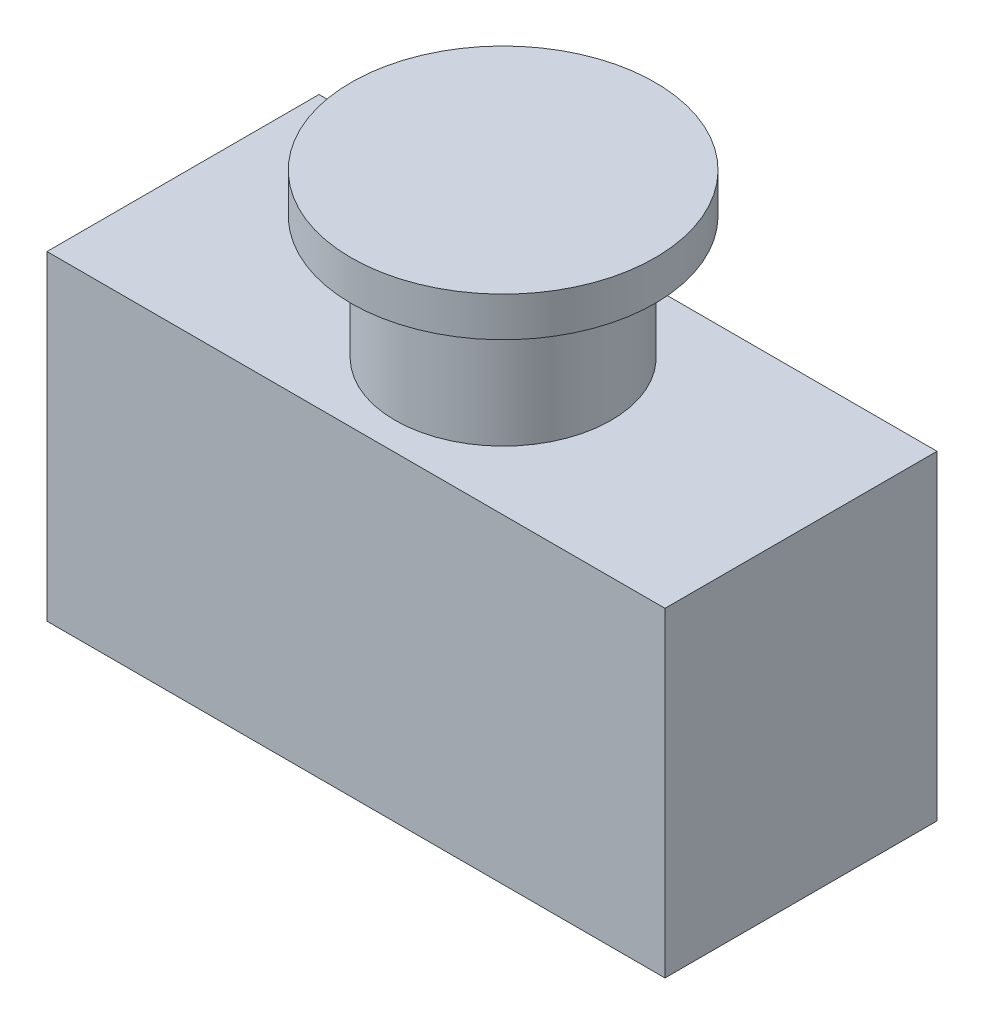
ISO-10303-21;
HEADER;
FILE_DESCRIPTION(('STEP AP214'),'2;1');
FILE_NAME('part.step','',(''),(''),'','','');
FILE_SCHEMA(('AUTOMOTIVE_DESIGN { 1 0 10303 214 1 1 1 1 }'));
ENDSEC;
DATA;
#1=APPLICATION_CONTEXT('core data for automotive mechanical design processes');
#2=APPLICATION_PROTOCOL_DEFINITION('international standard','automotive_design',2000,#1);
#3=PRODUCT_CONTEXT('',#1,'mechanical');
#4=PRODUCT('Part','Part','',(#3));
#5=PRODUCT_RELATED_PRODUCT_CATEGORY('part','',(#4));
#6=PRODUCT_DEFINITION_FORMATION('','',#4);
#7=PRODUCT_DEFINITION_CONTEXT('part definition',#1,'design');
#8=PRODUCT_DEFINITION('design','',#6,#7);
#9=PRODUCT_DEFINITION_SHAPE('','',#8);
#10=(LENGTH_UNIT() NAMED_UNIT(*) SI_UNIT(.MILLI.,.METRE.));
#11=(NAMED_UNIT(*) PLANE_ANGLE_UNIT() SI_UNIT($,.RADIAN.));
#12=(NAMED_UNIT(*) SI_UNIT($,.STERADIAN.) SOLID_ANGLE_UNIT());
#13=UNCERTAINTY_MEASURE_WITH_UNIT(LENGTH_MEASURE(1.E-05),#10,'distance_accuracy_value','');
#14=(GEOMETRIC_REPRESENTATION_CONTEXT(3) GLOBAL_UNCERTAINTY_ASSIGNED_CONTEXT((#13)) GLOBAL_UNIT_ASSIGNED_CONTEXT((#10,
#11,#12)) REPRESENTATION_CONTEXT('',''));
#15=CARTESIAN_POINT('',(0.,0.,0.));
#16=DIRECTION('',(0.,0.,1.));
#17=DIRECTION('',(1.,0.,0.));
#18=AXIS2_PLACEMENT_3D('',#15,#16,#17);
#19=CARTESIAN_POINT('',(126.415186096977,242.062,35.6459844357977));
#20=DIRECTION('',(0.,-1.,0.));
#21=DIRECTION('',(0.,0.,-1.));
#22=AXIS2_PLACEMENT_3D('',#19,#20,#21);
#23=CYLINDRICAL_SURFACE('',#22,54.2382607102503);
#24=CARTESIAN_POINT('',(126.415186096977,160.528,35.6459844357977));
#25=DIRECTION('',(0.,1.,0.));
#26=DIRECTION('',(0.,0.,1.));
#27=AXIS2_PLACEMENT_3D('',#24,#25,#26);
#28=CIRCLE('',#27,54.2382607102503);
#29=CARTESIAN_POINT('',(126.415186096977,160.528,89.884245146048));
#30=VERTEX_POINT('',#29);
#31=EDGE_CURVE('E103',#30,#30,#28,.T.);
#32=ORIENTED_EDGE('',*,*,#31,.T.);
#33=EDGE_LOOP('',(#32));
#34=FACE_BOUND('',#33,.T.);
#35=CARTESIAN_POINT('',(126.415186096977,222.25,35.6459844357977));
#36=DIRECTION('',(0.,1.,0.));
#37=DIRECTION('',(0.,0.,1.));
#38=AXIS2_PLACEMENT_3D('',#35,#36,#37);
#39=CIRCLE('',#38,54.2382607102503);
#40=CARTESIAN_POINT('',(126.415186096977,222.25,89.884245146048));
#41=VERTEX_POINT('',#40);
#42=EDGE_CURVE('E11',#41,#41,#39,.T.);
#43=ORIENTED_EDGE('',*,*,#42,.F.);
#44=EDGE_LOOP('',(#43));
#45=FACE_BOUND('',#44,.T.);
#46=ADVANCED_FACE('F32',(#34,#45),#23,.T.);
#47=CARTESIAN_POINT('',(-34.1128139030231,160.528,103.844984435798));
#48=DIRECTION('',(0.,1.,0.));
#49=DIRECTION('',(0.,0.,1.));
#50=AXIS2_PLACEMENT_3D('',#47,#48,#49);
#51=PLANE('',#50);
#52=DIRECTION('',(0.,0.,1.));
#53=VECTOR('',#52,1.);
#54=CARTESIAN_POINT('',(-34.1128139030231,160.528,-32.5530155642023));
#55=LINE('',#54,#53);
#56=CARTESIAN_POINT('',(-34.1128139030231,160.528,-32.5530155642023));
#57=VERTEX_POINT('',#56);
#58=CARTESIAN_POINT('',(-34.1128139030231,160.528,103.844984435798));
#59=VERTEX_POINT('',#58);
#60=EDGE_CURVE('E86',#57,#59,#55,.T.);
#61=ORIENTED_EDGE('',*,*,#60,.T.);
#62=DIRECTION('',(1.,0.,0.));
#63=VECTOR('',#62,1.);
#64=CARTESIAN_POINT('',(-34.1128139030231,160.528,103.844984435798));
#65=LINE('',#64,#63);
#66=CARTESIAN_POINT('',(275.767186096977,160.528,103.844984435798));
#67=VERTEX_POINT('',#66);
#68=EDGE_CURVE('E80',#59,#67,#65,.T.);
#69=ORIENTED_EDGE('',*,*,#68,.T.);
#70=DIRECTION('',(0.,0.,-1.));
#71=VECTOR('',#70,1.);
#72=CARTESIAN_POINT('',(275.767186096977,160.528,-32.5530155642023));
#73=LINE('',#72,#71);
#74=CARTESIAN_POINT('',(275.767186096977,160.528,-32.5530155642023));
#75=VERTEX_POINT('',#74);
#76=EDGE_CURVE('E84',#67,#75,#73,.T.);
#77=ORIENTED_EDGE('',*,*,#76,.T.);
#78=DIRECTION('',(-1.,0.,0.));
#79=VECTOR('',#78,1.);
#80=CARTESIAN_POINT('',(-34.1128139030231,160.528,-32.5530155642023));
#81=LINE('',#80,#79);
#82=EDGE_CURVE('E49',#75,#57,#81,.T.);
#83=ORIENTED_EDGE('',*,*,#82,.T.);
#84=EDGE_LOOP('',(#61,#69,#77,#83));
#85=FACE_BOUND('',#84,.T.);
#86=ORIENTED_EDGE('',*,*,#31,.F.);
#87=EDGE_LOOP('',(#86));
#88=FACE_BOUND('',#87,.T.);
#89=ADVANCED_FACE('F81',(#85,#88),#51,.T.);
#90=CARTESIAN_POINT('',(-34.1128139030231,160.528,-32.5530155642023));
#91=DIRECTION('',(1.,0.,0.));
#92=DIRECTION('',(0.,0.,-1.));
#93=AXIS2_PLACEMENT_3D('',#90,#91,#92);
#94=PLANE('',#93);
#95=DIRECTION('',(0.,0.,1.));
#96=VECTOR('',#95,1.);
#97=CARTESIAN_POINT('',(-34.1128139030231,0.,-32.5530155642023));
#98=LINE('',#97,#96);
#99=CARTESIAN_POINT('',(-34.1128139030231,0.,-32.5530155642023));
#100=VERTEX_POINT('',#99);
#101=CARTESIAN_POINT('',(-34.1128139030231,0.,103.844984435798));
#102=VERTEX_POINT('',#101);
#103=EDGE_CURVE('E100',#100,#102,#98,.T.);
#104=ORIENTED_EDGE('',*,*,#103,.T.);
#105=DIRECTION('',(0.,-1.,0.));
#106=VECTOR('',#105,1.);
#107=CARTESIAN_POINT('',(-34.1128139030231,160.528,103.844984435798));
#108=LINE('',#107,#106);
#109=EDGE_CURVE('E41',#59,#102,#108,.T.);
#110=ORIENTED_EDGE('',*,*,#109,.F.);
#111=ORIENTED_EDGE('',*,*,#60,.F.);
#112=DIRECTION('',(0.,-1.,0.));
#113=VECTOR('',#112,1.);
#114=CARTESIAN_POINT('',(-34.1128139030231,160.528,-32.5530155642023));
#115=LINE('',#114,#113);
#116=EDGE_CURVE('E96',#57,#100,#115,.T.);
#117=ORIENTED_EDGE('',*,*,#116,.T.);
#118=EDGE_LOOP('',(#104,#110,#111,#117));
#119=FACE_BOUND('',#118,.T.);
#120=ADVANCED_FACE('F34',(#119),#94,.F.);
#121=CARTESIAN_POINT('',(-34.1128139030231,160.528,103.844984435798));
#122=DIRECTION('',(0.,0.,-1.));
#123=DIRECTION('',(-1.,0.,0.));
#124=AXIS2_PLACEMENT_3D('',#121,#122,#123);
#125=PLANE('',#124);
#126=DIRECTION('',(1.,0.,0.));
#127=VECTOR('',#126,1.);
#128=CARTESIAN_POINT('',(-34.1128139030231,0.,103.844984435798));
#129=LINE('',#128,#127);
#130=CARTESIAN_POINT('',(275.767186096977,0.,103.844984435798));
#131=VERTEX_POINT('',#130);
#132=EDGE_CURVE('E91',#102,#131,#129,.T.);
#133=ORIENTED_EDGE('',*,*,#132,.T.);
#134=DIRECTION('',(0.,-1.,0.));
#135=VECTOR('',#134,1.);
#136=CARTESIAN_POINT('',(275.767186096977,160.528,103.844984435798));
#137=LINE('',#136,#135);
#138=EDGE_CURVE('E89',#67,#131,#137,.T.);
#139=ORIENTED_EDGE('',*,*,#138,.F.);
#140=ORIENTED_EDGE('',*,*,#68,.F.);
#141=ORIENTED_EDGE('',*,*,#109,.T.);
#142=EDGE_LOOP('',(#133,#139,#140,#141));
#143=FACE_BOUND('',#142,.T.);
#144=ADVANCED_FACE('F90',(#143),#125,.F.);
#145=CARTESIAN_POINT('',(275.767186096977,160.528,-32.5530155642023));
#146=DIRECTION('',(-1.,0.,0.));
#147=DIRECTION('',(0.,0.,1.));
#148=AXIS2_PLACEMENT_3D('',#145,#146,#147);
#149=PLANE('',#148);
#150=DIRECTION('',(0.,0.,-1.));
#151=VECTOR('',#150,1.);
#152=CARTESIAN_POINT('',(275.767186096977,0.,-32.5530155642023));
#153=LINE('',#152,#151);
#154=CARTESIAN_POINT('',(275.767186096977,0.,-32.5530155642023));
#155=VERTEX_POINT('',#154);
#156=EDGE_CURVE('E66',#131,#155,#153,.T.);
#157=ORIENTED_EDGE('',*,*,#156,.T.);
#158=DIRECTION('',(0.,-1.,0.));
#159=VECTOR('',#158,1.);
#160=CARTESIAN_POINT('',(275.767186096977,160.528,-32.5530155642023));
#161=LINE('',#160,#159);
#162=EDGE_CURVE('E92',#75,#155,#161,.T.);
#163=ORIENTED_EDGE('',*,*,#162,.F.);
#164=ORIENTED_EDGE('',*,*,#76,.F.);
#165=ORIENTED_EDGE('',*,*,#138,.T.);
#166=EDGE_LOOP('',(#157,#163,#164,#165));
#167=FACE_BOUND('',#166,.T.);
#168=ADVANCED_FACE('F94',(#167),#149,.F.);
#169=CARTESIAN_POINT('',(-34.1128139030231,160.528,-32.5530155642023));
#170=DIRECTION('',(0.,0.,1.));
#171=DIRECTION('',(1.,0.,0.));
#172=AXIS2_PLACEMENT_3D('',#169,#170,#171);
#173=PLANE('',#172);
#174=DIRECTION('',(-1.,0.,0.));
#175=VECTOR('',#174,1.);
#176=CARTESIAN_POINT('',(-34.1128139030231,0.,-32.5530155642023));
#177=LINE('',#176,#175);
#178=EDGE_CURVE('E72',#155,#100,#177,.T.);
#179=ORIENTED_EDGE('',*,*,#178,.T.);
#180=ORIENTED_EDGE('',*,*,#116,.F.);
#181=ORIENTED_EDGE('',*,*,#82,.F.);
#182=ORIENTED_EDGE('',*,*,#162,.T.);
#183=EDGE_LOOP('',(#179,#180,#181,#182));
#184=FACE_BOUND('',#183,.T.);
#185=ADVANCED_FACE('F114',(#184),#173,.F.);
#186=CARTESIAN_POINT('',(-34.1128139030231,0.,103.844984435798));
#187=DIRECTION('',(0.,1.,0.));
#188=DIRECTION('',(0.,0.,1.));
#189=AXIS2_PLACEMENT_3D('',#186,#187,#188);
#190=PLANE('',#189);
#191=ORIENTED_EDGE('',*,*,#103,.F.);
#192=ORIENTED_EDGE('',*,*,#178,.F.);
#193=ORIENTED_EDGE('',*,*,#156,.F.);
#194=ORIENTED_EDGE('',*,*,#132,.F.);
#195=EDGE_LOOP('',(#191,#192,#193,#194));
#196=FACE_BOUND('',#195,.T.);
#197=ADVANCED_FACE('F111',(#196),#190,.F.);
#198=CARTESIAN_POINT('',(126.415186096977,222.25,35.6459844357977));
#199=DIRECTION('',(0.,1.,0.));
#200=DIRECTION('',(0.,0.,1.));
#201=AXIS2_PLACEMENT_3D('',#198,#199,#200);
#202=PLANE('',#201);
#203=CARTESIAN_POINT('',(126.415186096977,222.25,35.6459844357977));
#204=DIRECTION('',(0.,1.,0.));
#205=DIRECTION('',(0.,0.,1.));
#206=AXIS2_PLACEMENT_3D('',#203,#204,#205);
#207=CIRCLE('',#206,76.2);
#208=CARTESIAN_POINT('',(126.415186096977,222.25,111.845984435798));
#209=VERTEX_POINT('',#208);
#210=EDGE_CURVE('E145',#209,#209,#207,.T.);
#211=ORIENTED_EDGE('',*,*,#210,.F.);
#212=EDGE_LOOP('',(#211));
#213=FACE_BOUND('',#212,.T.);
#214=ORIENTED_EDGE('',*,*,#42,.T.);
#215=EDGE_LOOP('',(#214));
#216=FACE_BOUND('',#215,.T.);
#217=ADVANCED_FACE('F113',(#213,#216),#202,.F.);
#218=CARTESIAN_POINT('',(126.415186096977,222.25,35.6459844357977));
#219=DIRECTION('',(0.,1.,0.));
#220=DIRECTION('',(0.,0.,1.));
#221=AXIS2_PLACEMENT_3D('',#218,#219,#220);
#222=CYLINDRICAL_SURFACE('',#221,76.2);
#223=ORIENTED_EDGE('',*,*,#210,.T.);
#224=EDGE_LOOP('',(#223));
#225=FACE_BOUND('',#224,.T.);
#226=CARTESIAN_POINT('',(126.415186096977,242.062,35.6459844357977));
#227=DIRECTION('',(0.,1.,0.));
#228=DIRECTION('',(0.,0.,1.));
#229=AXIS2_PLACEMENT_3D('',#226,#227,#228);
#230=CIRCLE('',#229,76.2);
#231=CARTESIAN_POINT('',(126.415186096977,242.062,111.845984435798));
#232=VERTEX_POINT('',#231);
#233=EDGE_CURVE('E148',#232,#232,#230,.T.);
#234=ORIENTED_EDGE('',*,*,#233,.F.);
#235=EDGE_LOOP('',(#234));
#236=FACE_BOUND('',#235,.T.);
#237=ADVANCED_FACE('F120',(#225,#236),#222,.T.);
#238=CARTESIAN_POINT('',(126.415186096977,242.062,35.6459844357977));
#239=DIRECTION('',(0.,1.,0.));
#240=DIRECTION('',(0.,0.,1.));
#241=AXIS2_PLACEMENT_3D('',#238,#239,#240);
#242=PLANE('',#241);
#243=ORIENTED_EDGE('',*,*,#233,.T.);
#244=EDGE_LOOP('',(#243));
#245=FACE_BOUND('',#244,.T.);
#246=ADVANCED_FACE('F134',(#245),#242,.T.);
#247=CLOSED_SHELL('',(#46,#89,#120,#144,#168,#185,#197,#217,#237,#246));
#248=MANIFOLD_SOLID_BREP('B2',#247);
#249=ADVANCED_BREP_SHAPE_REPRESENTATION('',(#18,#248),#14);
#250=SHAPE_DEFINITION_REPRESENTATION(#9,#249);
ENDSEC;
END-ISO-10303-21;
